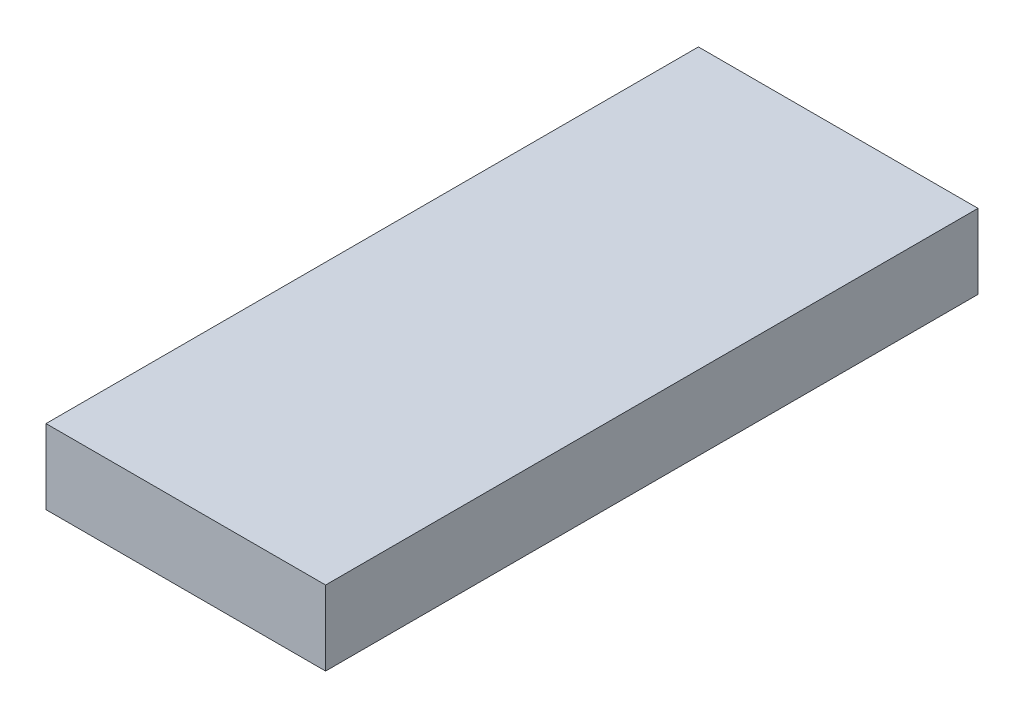
ISO-10303-21;
HEADER;
FILE_DESCRIPTION(('STEP AP214'),'2;1');
FILE_NAME('part.step','',(''),(''),'','','');
FILE_SCHEMA(('AUTOMOTIVE_DESIGN { 1 0 10303 214 1 1 1 1 }'));
ENDSEC;
DATA;
#1=APPLICATION_CONTEXT('core data for automotive mechanical design processes');
#2=APPLICATION_PROTOCOL_DEFINITION('international standard','automotive_design',2000,#1);
#3=PRODUCT_CONTEXT('',#1,'mechanical');
#4=PRODUCT('Part','Part','',(#3));
#5=PRODUCT_RELATED_PRODUCT_CATEGORY('part','',(#4));
#6=PRODUCT_DEFINITION_FORMATION('','',#4);
#7=PRODUCT_DEFINITION_CONTEXT('part definition',#1,'design');
#8=PRODUCT_DEFINITION('design','',#6,#7);
#9=PRODUCT_DEFINITION_SHAPE('','',#8);
#10=(LENGTH_UNIT() NAMED_UNIT(*) SI_UNIT(.MILLI.,.METRE.));
#11=(NAMED_UNIT(*) PLANE_ANGLE_UNIT() SI_UNIT($,.RADIAN.));
#12=(NAMED_UNIT(*) SI_UNIT($,.STERADIAN.) SOLID_ANGLE_UNIT());
#13=UNCERTAINTY_MEASURE_WITH_UNIT(LENGTH_MEASURE(1.E-05),#10,'distance_accuracy_value','');
#14=(GEOMETRIC_REPRESENTATION_CONTEXT(3) GLOBAL_UNCERTAINTY_ASSIGNED_CONTEXT((#13)) GLOBAL_UNIT_ASSIGNED_CONTEXT((#10,
#11,#12)) REPRESENTATION_CONTEXT('',''));
#15=CARTESIAN_POINT('',(0.,0.,0.));
#16=DIRECTION('',(0.,0.,1.));
#17=DIRECTION('',(1.,0.,0.));
#18=AXIS2_PLACEMENT_3D('',#15,#16,#17);
#19=CARTESIAN_POINT('',(0.,2.,0.));
#20=DIRECTION('',(1.,0.,0.));
#21=DIRECTION('',(0.,0.,-1.));
#22=AXIS2_PLACEMENT_3D('',#19,#20,#21);
#23=PLANE('',#22);
#24=DIRECTION('',(0.,0.,1.));
#25=VECTOR('',#24,1.);
#26=CARTESIAN_POINT('',(0.,0.,0.));
#27=LINE('',#26,#25);
#28=CARTESIAN_POINT('',(0.,0.,-17.5));
#29=VERTEX_POINT('',#28);
#30=CARTESIAN_POINT('',(0.,0.,0.));
#31=VERTEX_POINT('',#30);
#32=EDGE_CURVE('E107',#29,#31,#27,.T.);
#33=ORIENTED_EDGE('',*,*,#32,.T.);
#34=DIRECTION('',(0.,-1.,0.));
#35=VECTOR('',#34,1.);
#36=CARTESIAN_POINT('',(0.,2.,0.));
#37=LINE('',#36,#35);
#38=CARTESIAN_POINT('',(0.,2.,0.));
#39=VERTEX_POINT('',#38);
#40=EDGE_CURVE('E11',#39,#31,#37,.T.);
#41=ORIENTED_EDGE('',*,*,#40,.F.);
#42=DIRECTION('',(0.,0.,1.));
#43=VECTOR('',#42,1.);
#44=CARTESIAN_POINT('',(0.,2.,0.));
#45=LINE('',#44,#43);
#46=CARTESIAN_POINT('',(0.,2.,-17.5));
#47=VERTEX_POINT('',#46);
#48=EDGE_CURVE('E90',#47,#39,#45,.T.);
#49=ORIENTED_EDGE('',*,*,#48,.F.);
#50=DIRECTION('',(0.,-1.,0.));
#51=VECTOR('',#50,1.);
#52=CARTESIAN_POINT('',(0.,2.,-17.5));
#53=LINE('',#52,#51);
#54=EDGE_CURVE('E103',#47,#29,#53,.T.);
#55=ORIENTED_EDGE('',*,*,#54,.T.);
#56=EDGE_LOOP('',(#33,#41,#49,#55));
#57=FACE_BOUND('',#56,.T.);
#58=ADVANCED_FACE('F38',(#57),#23,.F.);
#59=CARTESIAN_POINT('',(0.,2.,0.));
#60=DIRECTION('',(0.,0.,-1.));
#61=DIRECTION('',(-1.,0.,0.));
#62=AXIS2_PLACEMENT_3D('',#59,#60,#61);
#63=PLANE('',#62);
#64=DIRECTION('',(1.,0.,0.));
#65=VECTOR('',#64,1.);
#66=CARTESIAN_POINT('',(0.,0.,0.));
#67=LINE('',#66,#65);
#68=CARTESIAN_POINT('',(7.5,0.,0.));
#69=VERTEX_POINT('',#68);
#70=EDGE_CURVE('E95',#31,#69,#67,.T.);
#71=ORIENTED_EDGE('',*,*,#70,.T.);
#72=DIRECTION('',(0.,-1.,0.));
#73=VECTOR('',#72,1.);
#74=CARTESIAN_POINT('',(7.5,2.,0.));
#75=LINE('',#74,#73);
#76=CARTESIAN_POINT('',(7.5,2.,0.));
#77=VERTEX_POINT('',#76);
#78=EDGE_CURVE('E47',#77,#69,#75,.T.);
#79=ORIENTED_EDGE('',*,*,#78,.F.);
#80=DIRECTION('',(1.,0.,0.));
#81=VECTOR('',#80,1.);
#82=CARTESIAN_POINT('',(0.,2.,0.));
#83=LINE('',#82,#81);
#84=EDGE_CURVE('E85',#39,#77,#83,.T.);
#85=ORIENTED_EDGE('',*,*,#84,.F.);
#86=ORIENTED_EDGE('',*,*,#40,.T.);
#87=EDGE_LOOP('',(#71,#79,#85,#86));
#88=FACE_BOUND('',#87,.T.);
#89=ADVANCED_FACE('F94',(#88),#63,.F.);
#90=CARTESIAN_POINT('',(7.5,2.,0.));
#91=DIRECTION('',(-1.,0.,0.));
#92=DIRECTION('',(0.,0.,1.));
#93=AXIS2_PLACEMENT_3D('',#90,#91,#92);
#94=PLANE('',#93);
#95=DIRECTION('',(0.,0.,-1.));
#96=VECTOR('',#95,1.);
#97=CARTESIAN_POINT('',(7.5,0.,0.));
#98=LINE('',#97,#96);
#99=CARTESIAN_POINT('',(7.5,0.,-17.5));
#100=VERTEX_POINT('',#99);
#101=EDGE_CURVE('E72',#69,#100,#98,.T.);
#102=ORIENTED_EDGE('',*,*,#101,.T.);
#103=DIRECTION('',(0.,-1.,0.));
#104=VECTOR('',#103,1.);
#105=CARTESIAN_POINT('',(7.5,2.,-17.5));
#106=LINE('',#105,#104);
#107=CARTESIAN_POINT('',(7.5,2.,-17.5));
#108=VERTEX_POINT('',#107);
#109=EDGE_CURVE('E97',#108,#100,#106,.T.);
#110=ORIENTED_EDGE('',*,*,#109,.F.);
#111=DIRECTION('',(0.,0.,-1.));
#112=VECTOR('',#111,1.);
#113=CARTESIAN_POINT('',(7.5,2.,0.));
#114=LINE('',#113,#112);
#115=EDGE_CURVE('E88',#77,#108,#114,.T.);
#116=ORIENTED_EDGE('',*,*,#115,.F.);
#117=ORIENTED_EDGE('',*,*,#78,.T.);
#118=EDGE_LOOP('',(#102,#110,#116,#117));
#119=FACE_BOUND('',#118,.T.);
#120=ADVANCED_FACE('F98',(#119),#94,.F.);
#121=CARTESIAN_POINT('',(0.,2.,-17.5));
#122=DIRECTION('',(0.,0.,1.));
#123=DIRECTION('',(1.,0.,0.));
#124=AXIS2_PLACEMENT_3D('',#121,#122,#123);
#125=PLANE('',#124);
#126=DIRECTION('',(-1.,0.,0.));
#127=VECTOR('',#126,1.);
#128=CARTESIAN_POINT('',(0.,0.,-17.5));
#129=LINE('',#128,#127);
#130=EDGE_CURVE('E78',#100,#29,#129,.T.);
#131=ORIENTED_EDGE('',*,*,#130,.T.);
#132=ORIENTED_EDGE('',*,*,#54,.F.);
#133=DIRECTION('',(-1.,0.,0.));
#134=VECTOR('',#133,1.);
#135=CARTESIAN_POINT('',(0.,2.,-17.5));
#136=LINE('',#135,#134);
#137=EDGE_CURVE('E55',#108,#47,#136,.T.);
#138=ORIENTED_EDGE('',*,*,#137,.F.);
#139=ORIENTED_EDGE('',*,*,#109,.T.);
#140=EDGE_LOOP('',(#131,#132,#138,#139));
#141=FACE_BOUND('',#140,.T.);
#142=ADVANCED_FACE('F121',(#141),#125,.F.);
#143=CARTESIAN_POINT('',(0.,2.,0.));
#144=DIRECTION('',(0.,-1.,0.));
#145=DIRECTION('',(0.,0.,-1.));
#146=AXIS2_PLACEMENT_3D('',#143,#144,#145);
#147=PLANE('',#146);
#148=ORIENTED_EDGE('',*,*,#48,.T.);
#149=ORIENTED_EDGE('',*,*,#84,.T.);
#150=ORIENTED_EDGE('',*,*,#115,.T.);
#151=ORIENTED_EDGE('',*,*,#137,.T.);
#152=EDGE_LOOP('',(#148,#149,#150,#151));
#153=FACE_BOUND('',#152,.T.);
#154=ADVANCED_FACE('F86',(#153),#147,.F.);
#155=CARTESIAN_POINT('',(0.,0.,0.));
#156=DIRECTION('',(0.,-1.,0.));
#157=DIRECTION('',(0.,0.,-1.));
#158=AXIS2_PLACEMENT_3D('',#155,#156,#157);
#159=PLANE('',#158);
#160=ORIENTED_EDGE('',*,*,#32,.F.);
#161=ORIENTED_EDGE('',*,*,#130,.F.);
#162=ORIENTED_EDGE('',*,*,#101,.F.);
#163=ORIENTED_EDGE('',*,*,#70,.F.);
#164=EDGE_LOOP('',(#160,#161,#162,#163));
#165=FACE_BOUND('',#164,.T.);
#166=ADVANCED_FACE('F124',(#165),#159,.T.);
#167=CLOSED_SHELL('',(#58,#89,#120,#142,#154,#166));
#168=MANIFOLD_SOLID_BREP('B2',#167);
#169=ADVANCED_BREP_SHAPE_REPRESENTATION('',(#18,#168),#14);
#170=SHAPE_DEFINITION_REPRESENTATION(#9,#169);
ENDSEC;
END-ISO-10303-21;
